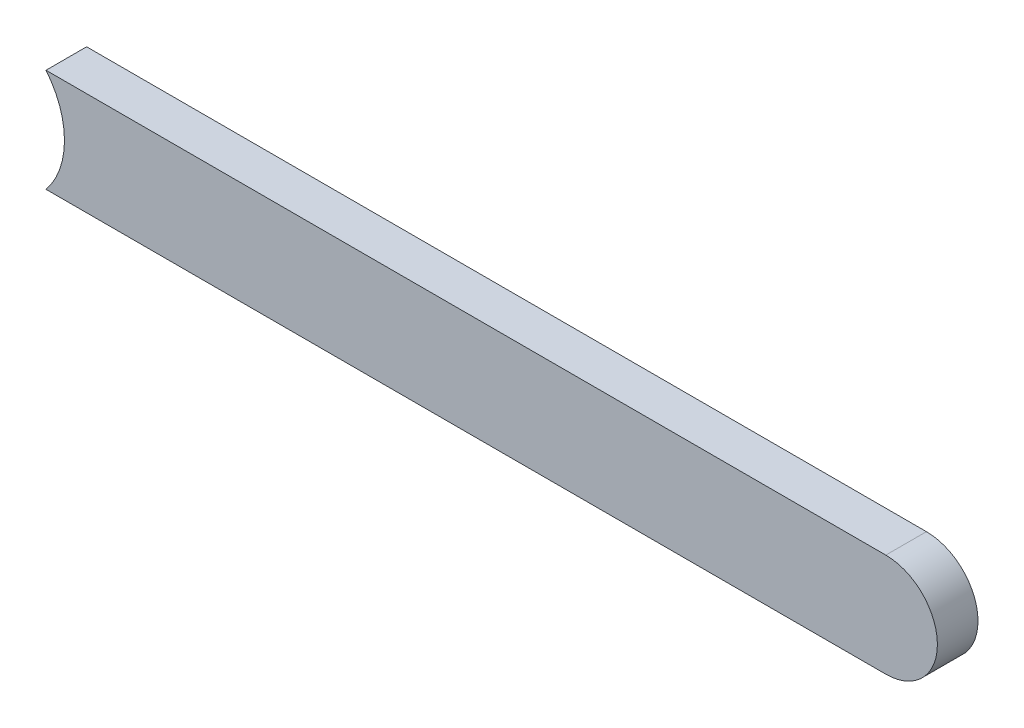
ISO-10303-21;
HEADER;
FILE_DESCRIPTION(('STEP AP214'),'2;1');
FILE_NAME('part.step','',(''),(''),'','','');
FILE_SCHEMA(('AUTOMOTIVE_DESIGN { 1 0 10303 214 1 1 1 1 }'));
ENDSEC;
DATA;
#1=APPLICATION_CONTEXT('core data for automotive mechanical design processes');
#2=APPLICATION_PROTOCOL_DEFINITION('international standard','automotive_design',2000,#1);
#3=PRODUCT_CONTEXT('',#1,'mechanical');
#4=PRODUCT('Part','Part','',(#3));
#5=PRODUCT_RELATED_PRODUCT_CATEGORY('part','',(#4));
#6=PRODUCT_DEFINITION_FORMATION('','',#4);
#7=PRODUCT_DEFINITION_CONTEXT('part definition',#1,'design');
#8=PRODUCT_DEFINITION('design','',#6,#7);
#9=PRODUCT_DEFINITION_SHAPE('','',#8);
#10=(LENGTH_UNIT() NAMED_UNIT(*) SI_UNIT(.MILLI.,.METRE.));
#11=(NAMED_UNIT(*) PLANE_ANGLE_UNIT() SI_UNIT($,.RADIAN.));
#12=(NAMED_UNIT(*) SI_UNIT($,.STERADIAN.) SOLID_ANGLE_UNIT());
#13=UNCERTAINTY_MEASURE_WITH_UNIT(LENGTH_MEASURE(1.E-05),#10,'distance_accuracy_value','');
#14=(GEOMETRIC_REPRESENTATION_CONTEXT(3) GLOBAL_UNCERTAINTY_ASSIGNED_CONTEXT((#13)) GLOBAL_UNIT_ASSIGNED_CONTEXT((#10,
#11,#12)) REPRESENTATION_CONTEXT('',''));
#15=CARTESIAN_POINT('',(0.,0.,0.));
#16=DIRECTION('',(0.,0.,1.));
#17=DIRECTION('',(1.,0.,0.));
#18=AXIS2_PLACEMENT_3D('',#15,#16,#17);
#19=CARTESIAN_POINT('',(130.865003818748,57.404,0.));
#20=DIRECTION('',(0.,1.,0.));
#21=DIRECTION('',(1.,0.,0.));
#22=AXIS2_PLACEMENT_3D('',#19,#20,#21);
#23=PLANE('',#22);
#24=DIRECTION('',(1.,0.,0.));
#25=VECTOR('',#24,1.);
#26=CARTESIAN_POINT('',(130.556,57.404,0.1999996));
#27=LINE('',#26,#25);
#28=CARTESIAN_POINT('',(130.865003818748,57.404,0.1999996));
#29=VERTEX_POINT('',#28);
#30=CARTESIAN_POINT('',(135.001,57.404,0.1999996));
#31=VERTEX_POINT('',#30);
#32=EDGE_CURVE('E11',#29,#31,#27,.T.);
#33=ORIENTED_EDGE('',*,*,#32,.F.);
#34=DIRECTION('',(0.,0.,1.));
#35=VECTOR('',#34,1.);
#36=CARTESIAN_POINT('',(130.865003818748,57.404,0.));
#37=LINE('',#36,#35);
#38=CARTESIAN_POINT('',(130.865003818748,57.404,0.));
#39=VERTEX_POINT('',#38);
#40=EDGE_CURVE('E24',#39,#29,#37,.T.);
#41=ORIENTED_EDGE('',*,*,#40,.F.);
#42=DIRECTION('',(1.,0.,0.));
#43=VECTOR('',#42,1.);
#44=CARTESIAN_POINT('',(130.556,57.404,0.));
#45=LINE('',#44,#43);
#46=CARTESIAN_POINT('',(135.001,57.404,0.));
#47=VERTEX_POINT('',#46);
#48=EDGE_CURVE('E82',#39,#47,#45,.T.);
#49=ORIENTED_EDGE('',*,*,#48,.T.);
#50=DIRECTION('',(0.,0.,1.));
#51=VECTOR('',#50,1.);
#52=CARTESIAN_POINT('',(135.001,57.404,0.));
#53=LINE('',#52,#51);
#54=EDGE_CURVE('E37',#47,#31,#53,.T.);
#55=ORIENTED_EDGE('',*,*,#54,.T.);
#56=EDGE_LOOP('',(#33,#41,#49,#55));
#57=FACE_BOUND('',#56,.T.);
#58=ADVANCED_FACE('F17',(#57),#23,.F.);
#59=CARTESIAN_POINT('',(135.001,57.658,0.));
#60=DIRECTION('',(0.,0.,-1.));
#61=DIRECTION('',(1.11896493820489E-13,-1.,0.));
#62=AXIS2_PLACEMENT_3D('',#59,#60,#61);
#63=CYLINDRICAL_SURFACE('',#62,0.254000000000005);
#64=CARTESIAN_POINT('',(135.001,57.658,0.1999996));
#65=DIRECTION('',(0.,0.,1.));
#66=DIRECTION('',(1.11896493820489E-13,-1.,0.));
#67=AXIS2_PLACEMENT_3D('',#64,#65,#66);
#68=CIRCLE('',#67,0.254000000000005);
#69=CARTESIAN_POINT('',(135.001,57.912,0.1999996));
#70=VERTEX_POINT('',#69);
#71=EDGE_CURVE('E97',#31,#70,#68,.T.);
#72=ORIENTED_EDGE('',*,*,#71,.F.);
#73=ORIENTED_EDGE('',*,*,#54,.F.);
#74=CARTESIAN_POINT('',(135.001,57.658,0.));
#75=DIRECTION('',(0.,0.,1.));
#76=DIRECTION('',(1.11896493820489E-13,-1.,0.));
#77=AXIS2_PLACEMENT_3D('',#74,#75,#76);
#78=CIRCLE('',#77,0.254000000000005);
#79=CARTESIAN_POINT('',(135.001,57.912,0.));
#80=VERTEX_POINT('',#79);
#81=EDGE_CURVE('E94',#47,#80,#78,.T.);
#82=ORIENTED_EDGE('',*,*,#81,.T.);
#83=DIRECTION('',(0.,0.,1.));
#84=VECTOR('',#83,1.);
#85=CARTESIAN_POINT('',(135.001,57.912,0.));
#86=LINE('',#85,#84);
#87=EDGE_CURVE('E92',#80,#70,#86,.T.);
#88=ORIENTED_EDGE('',*,*,#87,.T.);
#89=EDGE_LOOP('',(#72,#73,#82,#88));
#90=FACE_BOUND('',#89,.T.);
#91=ADVANCED_FACE('F103',(#90),#63,.T.);
#92=CARTESIAN_POINT('',(135.001,57.912,0.));
#93=DIRECTION('',(0.,-1.,0.));
#94=DIRECTION('',(-1.,0.,0.));
#95=AXIS2_PLACEMENT_3D('',#92,#93,#94);
#96=PLANE('',#95);
#97=DIRECTION('',(-1.,0.,0.));
#98=VECTOR('',#97,1.);
#99=CARTESIAN_POINT('',(135.001,57.912,0.1999996));
#100=LINE('',#99,#98);
#101=CARTESIAN_POINT('',(130.865003818748,57.912,0.1999996));
#102=VERTEX_POINT('',#101);
#103=EDGE_CURVE('E89',#70,#102,#100,.T.);
#104=ORIENTED_EDGE('',*,*,#103,.F.);
#105=ORIENTED_EDGE('',*,*,#87,.F.);
#106=DIRECTION('',(-1.,0.,0.));
#107=VECTOR('',#106,1.);
#108=CARTESIAN_POINT('',(135.001,57.912,0.));
#109=LINE('',#108,#107);
#110=CARTESIAN_POINT('',(130.865003818748,57.912,0.));
#111=VERTEX_POINT('',#110);
#112=EDGE_CURVE('E87',#80,#111,#109,.T.);
#113=ORIENTED_EDGE('',*,*,#112,.T.);
#114=DIRECTION('',(0.,0.,1.));
#115=VECTOR('',#114,1.);
#116=CARTESIAN_POINT('',(130.865003818748,57.912,0.));
#117=LINE('',#116,#115);
#118=EDGE_CURVE('E69',#111,#102,#117,.T.);
#119=ORIENTED_EDGE('',*,*,#118,.T.);
#120=EDGE_LOOP('',(#104,#105,#113,#119));
#121=FACE_BOUND('',#120,.T.);
#122=ADVANCED_FACE('F108',(#121),#96,.F.);
#123=CARTESIAN_POINT('',(130.556,57.658,0.));
#124=DIRECTION('',(0.,0.,-1.));
#125=DIRECTION('',(1.,0.,0.));
#126=AXIS2_PLACEMENT_3D('',#123,#124,#125);
#127=CYLINDRICAL_SURFACE('',#126,0.3999992);
#128=DIRECTION('',(0.,0.,1.));
#129=VECTOR('',#128,1.);
#130=CARTESIAN_POINT('',(130.9559992,57.658,0.));
#131=LINE('',#130,#129);
#132=CARTESIAN_POINT('',(130.9559992,57.658,0.));
#133=VERTEX_POINT('',#132);
#134=CARTESIAN_POINT('',(130.9559992,57.658,0.1999996));
#135=VERTEX_POINT('',#134);
#136=EDGE_CURVE('E59',#133,#135,#131,.T.);
#137=ORIENTED_EDGE('',*,*,#136,.T.);
#138=CARTESIAN_POINT('',(130.556,57.658,0.1999996));
#139=DIRECTION('',(0.,0.,1.));
#140=DIRECTION('',(1.,0.,0.));
#141=AXIS2_PLACEMENT_3D('',#138,#139,#140);
#142=CIRCLE('',#141,0.3999992);
#143=EDGE_CURVE('E70',#135,#102,#142,.T.);
#144=ORIENTED_EDGE('',*,*,#143,.T.);
#145=ORIENTED_EDGE('',*,*,#118,.F.);
#146=CARTESIAN_POINT('',(130.556,57.658,0.));
#147=DIRECTION('',(0.,0.,1.));
#148=DIRECTION('',(1.,0.,0.));
#149=AXIS2_PLACEMENT_3D('',#146,#147,#148);
#150=CIRCLE('',#149,0.3999992);
#151=EDGE_CURVE('E73',#133,#111,#150,.T.);
#152=ORIENTED_EDGE('',*,*,#151,.F.);
#153=EDGE_LOOP('',(#137,#144,#145,#152));
#154=FACE_BOUND('',#153,.T.);
#155=ADVANCED_FACE('F74',(#154),#127,.F.);
#156=CARTESIAN_POINT('',(130.556,57.658,0.));
#157=DIRECTION('',(0.,0.,-1.));
#158=DIRECTION('',(1.,0.,0.));
#159=AXIS2_PLACEMENT_3D('',#156,#157,#158);
#160=CYLINDRICAL_SURFACE('',#159,0.3999992);
#161=ORIENTED_EDGE('',*,*,#40,.T.);
#162=CARTESIAN_POINT('',(130.556,57.658,0.1999996));
#163=DIRECTION('',(0.,0.,1.));
#164=DIRECTION('',(1.,0.,0.));
#165=AXIS2_PLACEMENT_3D('',#162,#163,#164);
#166=CIRCLE('',#165,0.3999992);
#167=EDGE_CURVE('E65',#29,#135,#166,.T.);
#168=ORIENTED_EDGE('',*,*,#167,.T.);
#169=ORIENTED_EDGE('',*,*,#136,.F.);
#170=EDGE_CURVE('E63',#39,#133,#150,.T.);
#171=ORIENTED_EDGE('',*,*,#170,.F.);
#172=EDGE_LOOP('',(#161,#168,#169,#171));
#173=FACE_BOUND('',#172,.T.);
#174=ADVANCED_FACE('F61',(#173),#160,.F.);
#175=CARTESIAN_POINT('',(130.556,57.404,0.));
#176=DIRECTION('',(0.,0.,-1.));
#177=DIRECTION('',(-1.,0.,0.));
#178=AXIS2_PLACEMENT_3D('',#175,#176,#177);
#179=PLANE('',#178);
#180=ORIENTED_EDGE('',*,*,#48,.F.);
#181=ORIENTED_EDGE('',*,*,#170,.T.);
#182=ORIENTED_EDGE('',*,*,#151,.T.);
#183=ORIENTED_EDGE('',*,*,#112,.F.);
#184=ORIENTED_EDGE('',*,*,#81,.F.);
#185=EDGE_LOOP('',(#180,#181,#182,#183,#184));
#186=FACE_BOUND('',#185,.T.);
#187=ADVANCED_FACE('F80',(#186),#179,.T.);
#188=CARTESIAN_POINT('',(130.556,57.404,0.1999996));
#189=DIRECTION('',(0.,0.,-1.));
#190=DIRECTION('',(-1.,0.,0.));
#191=AXIS2_PLACEMENT_3D('',#188,#189,#190);
#192=PLANE('',#191);
#193=ORIENTED_EDGE('',*,*,#167,.F.);
#194=ORIENTED_EDGE('',*,*,#32,.T.);
#195=ORIENTED_EDGE('',*,*,#71,.T.);
#196=ORIENTED_EDGE('',*,*,#103,.T.);
#197=ORIENTED_EDGE('',*,*,#143,.F.);
#198=EDGE_LOOP('',(#193,#194,#195,#196,#197));
#199=FACE_BOUND('',#198,.T.);
#200=ADVANCED_FACE('F106',(#199),#192,.F.);
#201=CLOSED_SHELL('',(#58,#91,#122,#155,#174,#187,#200));
#202=MANIFOLD_SOLID_BREP('B1',#201);
#203=ADVANCED_BREP_SHAPE_REPRESENTATION('',(#18,#202),#14);
#204=SHAPE_DEFINITION_REPRESENTATION(#9,#203);
ENDSEC;
END-ISO-10303-21;
